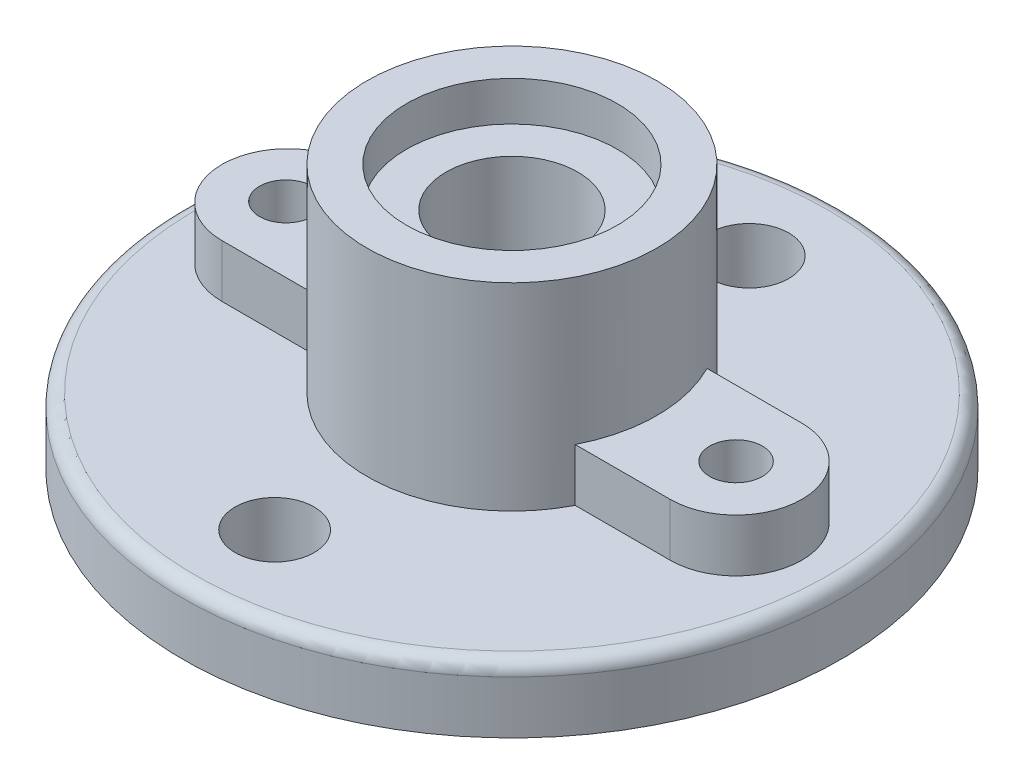
ISO-10303-21;
HEADER;
FILE_DESCRIPTION(('STEP AP214'),'2;1');
FILE_NAME('part.step','',(''),(''),'','','');
FILE_SCHEMA(('AUTOMOTIVE_DESIGN { 1 0 10303 214 1 1 1 1 }'));
ENDSEC;
DATA;
#1=APPLICATION_CONTEXT('core data for automotive mechanical design processes');
#2=APPLICATION_PROTOCOL_DEFINITION('international standard','automotive_design',2000,#1);
#3=PRODUCT_CONTEXT('',#1,'mechanical');
#4=PRODUCT('Part','Part','',(#3));
#5=PRODUCT_RELATED_PRODUCT_CATEGORY('part','',(#4));
#6=PRODUCT_DEFINITION_FORMATION('','',#4);
#7=PRODUCT_DEFINITION_CONTEXT('part definition',#1,'design');
#8=PRODUCT_DEFINITION('design','',#6,#7);
#9=PRODUCT_DEFINITION_SHAPE('','',#8);
#10=(LENGTH_UNIT() NAMED_UNIT(*) SI_UNIT(.MILLI.,.METRE.));
#11=(NAMED_UNIT(*) PLANE_ANGLE_UNIT() SI_UNIT($,.RADIAN.));
#12=(NAMED_UNIT(*) SI_UNIT($,.STERADIAN.) SOLID_ANGLE_UNIT());
#13=UNCERTAINTY_MEASURE_WITH_UNIT(LENGTH_MEASURE(1.E-05),#10,'distance_accuracy_value','');
#14=(GEOMETRIC_REPRESENTATION_CONTEXT(3) GLOBAL_UNCERTAINTY_ASSIGNED_CONTEXT((#13)) GLOBAL_UNIT_ASSIGNED_CONTEXT((#10,
#11,#12)) REPRESENTATION_CONTEXT('',''));
#15=CARTESIAN_POINT('',(0.,0.,0.));
#16=DIRECTION('',(0.,0.,1.));
#17=DIRECTION('',(1.,0.,0.));
#18=AXIS2_PLACEMENT_3D('',#15,#16,#17);
#19=CARTESIAN_POINT('',(0.,5.,0.));
#20=DIRECTION('',(0.,-1.,0.));
#21=DIRECTION('',(0.,0.,-1.));
#22=AXIS2_PLACEMENT_3D('',#19,#20,#21);
#23=PLANE('',#22);
#24=CARTESIAN_POINT('',(0.,5.,0.));
#25=DIRECTION('',(0.,-1.,0.));
#26=DIRECTION('',(0.,0.,-1.));
#27=AXIS2_PLACEMENT_3D('',#24,#25,#26);
#28=CIRCLE('',#27,24.);
#29=CARTESIAN_POINT('',(0.,5.,-24.));
#30=VERTEX_POINT('',#29);
#31=EDGE_CURVE('E11',#30,#30,#28,.F.);
#32=ORIENTED_EDGE('',*,*,#31,.T.);
#33=EDGE_LOOP('',(#32));
#34=FACE_BOUND('',#33,.T.);
#35=CARTESIAN_POINT('',(0.,5.,-18.));
#36=DIRECTION('',(0.,-1.,0.));
#37=DIRECTION('',(0.,0.,-1.));
#38=AXIS2_PLACEMENT_3D('',#35,#36,#37);
#39=CIRCLE('',#38,3.);
#40=CARTESIAN_POINT('',(0.,5.,-21.));
#41=VERTEX_POINT('',#40);
#42=EDGE_CURVE('E455',#41,#41,#39,.F.);
#43=ORIENTED_EDGE('',*,*,#42,.F.);
#44=EDGE_LOOP('',(#43));
#45=FACE_BOUND('',#44,.T.);
#46=CARTESIAN_POINT('',(0.,5.,18.));
#47=DIRECTION('',(0.,-1.,0.));
#48=DIRECTION('',(0.,0.,-1.));
#49=AXIS2_PLACEMENT_3D('',#46,#47,#48);
#50=CIRCLE('',#49,3.);
#51=CARTESIAN_POINT('',(0.,5.,15.));
#52=VERTEX_POINT('',#51);
#53=EDGE_CURVE('E452',#52,#52,#50,.F.);
#54=ORIENTED_EDGE('',*,*,#53,.F.);
#55=EDGE_LOOP('',(#54));
#56=FACE_BOUND('',#55,.T.);
#57=DIRECTION('',(1.,0.,0.));
#58=VECTOR('',#57,1.);
#59=CARTESIAN_POINT('',(0.,5.,5.));
#60=LINE('',#59,#58);
#61=CARTESIAN_POINT('',(9.79795897113272,5.,5.));
#62=VERTEX_POINT('',#61);
#63=CARTESIAN_POINT('',(17.,5.,5.));
#64=VERTEX_POINT('',#63);
#65=EDGE_CURVE('E144',#62,#64,#60,.T.);
#66=ORIENTED_EDGE('',*,*,#65,.F.);
#67=CARTESIAN_POINT('',(0.,5.,0.));
#68=DIRECTION('',(0.,-1.,0.));
#69=DIRECTION('',(0.,0.,-1.));
#70=AXIS2_PLACEMENT_3D('',#67,#68,#69);
#71=CIRCLE('',#70,11.);
#72=CARTESIAN_POINT('',(-9.79795897113271,5.,5.));
#73=VERTEX_POINT('',#72);
#74=EDGE_CURVE('E128',#62,#73,#71,.T.);
#75=ORIENTED_EDGE('',*,*,#74,.T.);
#76=DIRECTION('',(1.,0.,0.));
#77=VECTOR('',#76,1.);
#78=CARTESIAN_POINT('',(0.,5.,5.));
#79=LINE('',#78,#77);
#80=CARTESIAN_POINT('',(-17.,5.,5.));
#81=VERTEX_POINT('',#80);
#82=EDGE_CURVE('E178',#81,#73,#79,.T.);
#83=ORIENTED_EDGE('',*,*,#82,.F.);
#84=CARTESIAN_POINT('',(-17.,5.,0.));
#85=DIRECTION('',(0.,-1.,0.));
#86=DIRECTION('',(0.,0.,-1.));
#87=AXIS2_PLACEMENT_3D('',#84,#85,#86);
#88=CIRCLE('',#87,5.);
#89=CARTESIAN_POINT('',(-17.,5.,-5.));
#90=VERTEX_POINT('',#89);
#91=EDGE_CURVE('E114',#90,#81,#88,.F.);
#92=ORIENTED_EDGE('',*,*,#91,.F.);
#93=DIRECTION('',(1.,0.,0.));
#94=VECTOR('',#93,1.);
#95=CARTESIAN_POINT('',(0.,5.,-5.));
#96=LINE('',#95,#94);
#97=CARTESIAN_POINT('',(-9.79795897113272,5.,-5.));
#98=VERTEX_POINT('',#97);
#99=EDGE_CURVE('E174',#90,#98,#96,.T.);
#100=ORIENTED_EDGE('',*,*,#99,.T.);
#101=CARTESIAN_POINT('',(9.79795897113271,5.,-5.));
#102=VERTEX_POINT('',#101);
#103=EDGE_CURVE('E201',#98,#102,#71,.T.);
#104=ORIENTED_EDGE('',*,*,#103,.T.);
#105=DIRECTION('',(1.,0.,0.));
#106=VECTOR('',#105,1.);
#107=CARTESIAN_POINT('',(0.,5.,-5.));
#108=LINE('',#107,#106);
#109=CARTESIAN_POINT('',(17.,5.,-5.));
#110=VERTEX_POINT('',#109);
#111=EDGE_CURVE('E123',#102,#110,#108,.T.);
#112=ORIENTED_EDGE('',*,*,#111,.T.);
#113=CARTESIAN_POINT('',(17.,5.,0.));
#114=DIRECTION('',(0.,-1.,0.));
#115=DIRECTION('',(0.,0.,-1.));
#116=AXIS2_PLACEMENT_3D('',#113,#114,#115);
#117=CIRCLE('',#116,5.);
#118=EDGE_CURVE('E147',#64,#110,#117,.F.);
#119=ORIENTED_EDGE('',*,*,#118,.F.);
#120=EDGE_LOOP('',(#66,#75,#83,#92,#100,#104,#112,#119));
#121=FACE_BOUND('',#120,.T.);
#122=ADVANCED_FACE('F39',(#34,#45,#56,#121),#23,.F.);
#123=CARTESIAN_POINT('',(0.,0.,0.));
#124=DIRECTION('',(0.,-1.,0.));
#125=DIRECTION('',(0.,0.,-1.));
#126=AXIS2_PLACEMENT_3D('',#123,#124,#125);
#127=CYLINDRICAL_SURFACE('',#126,11.);
#128=CARTESIAN_POINT('',(0.,20.,0.));
#129=DIRECTION('',(0.,-1.,0.));
#130=DIRECTION('',(0.,0.,-1.));
#131=AXIS2_PLACEMENT_3D('',#128,#129,#130);
#132=CIRCLE('',#131,11.);
#133=CARTESIAN_POINT('',(0.,20.,-11.));
#134=VERTEX_POINT('',#133);
#135=EDGE_CURVE('E197',#134,#134,#132,.T.);
#136=ORIENTED_EDGE('',*,*,#135,.T.);
#137=EDGE_LOOP('',(#136));
#138=FACE_BOUND('',#137,.T.);
#139=DIRECTION('',(0.,-1.,0.));
#140=VECTOR('',#139,1.);
#141=CARTESIAN_POINT('',(9.79795897113272,9.,5.));
#142=LINE('',#141,#140);
#143=CARTESIAN_POINT('',(9.79795897113272,9.,5.));
#144=VERTEX_POINT('',#143);
#145=EDGE_CURVE('E118',#144,#62,#142,.T.);
#146=ORIENTED_EDGE('',*,*,#145,.F.);
#147=CARTESIAN_POINT('',(0.,9.,0.));
#148=DIRECTION('',(0.,1.,0.));
#149=DIRECTION('',(0.,0.,1.));
#150=AXIS2_PLACEMENT_3D('',#147,#148,#149);
#151=CIRCLE('',#150,11.);
#152=CARTESIAN_POINT('',(9.79795897113271,9.,-5.00000000000001));
#153=VERTEX_POINT('',#152);
#154=EDGE_CURVE('E105',#144,#153,#151,.T.);
#155=ORIENTED_EDGE('',*,*,#154,.T.);
#156=DIRECTION('',(0.,-1.,0.));
#157=VECTOR('',#156,1.);
#158=CARTESIAN_POINT('',(9.79795897113271,9.,-5.));
#159=LINE('',#158,#157);
#160=EDGE_CURVE('E130',#153,#102,#159,.T.);
#161=ORIENTED_EDGE('',*,*,#160,.T.);
#162=ORIENTED_EDGE('',*,*,#103,.F.);
#163=DIRECTION('',(0.,-1.,0.));
#164=VECTOR('',#163,1.);
#165=CARTESIAN_POINT('',(-9.79795897113272,9.,-5.));
#166=LINE('',#165,#164);
#167=CARTESIAN_POINT('',(-9.79795897113272,9.,-5.));
#168=VERTEX_POINT('',#167);
#169=EDGE_CURVE('E165',#168,#98,#166,.T.);
#170=ORIENTED_EDGE('',*,*,#169,.F.);
#171=CARTESIAN_POINT('',(0.,9.,0.));
#172=DIRECTION('',(0.,1.,0.));
#173=DIRECTION('',(0.,0.,1.));
#174=AXIS2_PLACEMENT_3D('',#171,#172,#173);
#175=CIRCLE('',#174,11.);
#176=CARTESIAN_POINT('',(-9.79795897113271,9.,5.00000000000001));
#177=VERTEX_POINT('',#176);
#178=EDGE_CURVE('E209',#168,#177,#175,.T.);
#179=ORIENTED_EDGE('',*,*,#178,.T.);
#180=DIRECTION('',(0.,-1.,0.));
#181=VECTOR('',#180,1.);
#182=CARTESIAN_POINT('',(-9.79795897113271,9.,5.));
#183=LINE('',#182,#181);
#184=EDGE_CURVE('E63',#177,#73,#183,.T.);
#185=ORIENTED_EDGE('',*,*,#184,.T.);
#186=ORIENTED_EDGE('',*,*,#74,.F.);
#187=EDGE_LOOP('',(#146,#155,#161,#162,#170,#179,#185,#186));
#188=FACE_BOUND('',#187,.T.);
#189=ADVANCED_FACE('F127',(#138,#188),#127,.T.);
#190=CARTESIAN_POINT('',(0.,0.,0.));
#191=DIRECTION('',(0.,1.,0.));
#192=DIRECTION('',(0.,0.,1.));
#193=AXIS2_PLACEMENT_3D('',#190,#191,#192);
#194=PLANE('',#193);
#195=CARTESIAN_POINT('',(-17.1423749287793,0.,0.));
#196=DIRECTION('',(0.,1.,0.));
#197=DIRECTION('',(0.,0.,1.));
#198=AXIS2_PLACEMENT_3D('',#195,#196,#197);
#199=CIRCLE('',#198,2.);
#200=CARTESIAN_POINT('',(-17.1423749287793,0.,2.));
#201=VERTEX_POINT('',#200);
#202=EDGE_CURVE('E252',#201,#201,#199,.T.);
#203=ORIENTED_EDGE('',*,*,#202,.T.);
#204=EDGE_LOOP('',(#203));
#205=FACE_BOUND('',#204,.T.);
#206=CARTESIAN_POINT('',(17.,0.,0.));
#207=DIRECTION('',(0.,1.,0.));
#208=DIRECTION('',(0.,0.,1.));
#209=AXIS2_PLACEMENT_3D('',#206,#207,#208);
#210=CIRCLE('',#209,2.);
#211=CARTESIAN_POINT('',(17.,0.,2.));
#212=VERTEX_POINT('',#211);
#213=EDGE_CURVE('E256',#212,#212,#210,.T.);
#214=ORIENTED_EDGE('',*,*,#213,.T.);
#215=EDGE_LOOP('',(#214));
#216=FACE_BOUND('',#215,.T.);
#217=CARTESIAN_POINT('',(0.,0.,-18.));
#218=DIRECTION('',(0.,1.,0.));
#219=DIRECTION('',(0.,0.,1.));
#220=AXIS2_PLACEMENT_3D('',#217,#218,#219);
#221=CIRCLE('',#220,3.);
#222=CARTESIAN_POINT('',(0.,0.,-15.));
#223=VERTEX_POINT('',#222);
#224=EDGE_CURVE('E260',#223,#223,#221,.T.);
#225=ORIENTED_EDGE('',*,*,#224,.T.);
#226=EDGE_LOOP('',(#225));
#227=FACE_BOUND('',#226,.T.);
#228=CARTESIAN_POINT('',(0.,0.,18.));
#229=DIRECTION('',(0.,1.,0.));
#230=DIRECTION('',(0.,0.,1.));
#231=AXIS2_PLACEMENT_3D('',#228,#229,#230);
#232=CIRCLE('',#231,3.);
#233=CARTESIAN_POINT('',(0.,0.,21.));
#234=VERTEX_POINT('',#233);
#235=EDGE_CURVE('E264',#234,#234,#232,.T.);
#236=ORIENTED_EDGE('',*,*,#235,.T.);
#237=EDGE_LOOP('',(#236));
#238=FACE_BOUND('',#237,.T.);
#239=CARTESIAN_POINT('',(0.,0.,0.));
#240=DIRECTION('',(0.,1.,0.));
#241=DIRECTION('',(0.,0.,1.));
#242=AXIS2_PLACEMENT_3D('',#239,#240,#241);
#243=CIRCLE('',#242,5.);
#244=CARTESIAN_POINT('',(0.,0.,5.));
#245=VERTEX_POINT('',#244);
#246=EDGE_CURVE('E189',#245,#245,#243,.T.);
#247=ORIENTED_EDGE('',*,*,#246,.T.);
#248=EDGE_LOOP('',(#247));
#249=FACE_BOUND('',#248,.T.);
#250=CARTESIAN_POINT('',(0.,0.,0.));
#251=DIRECTION('',(0.,-1.,0.));
#252=DIRECTION('',(0.,0.,-1.));
#253=AXIS2_PLACEMENT_3D('',#250,#251,#252);
#254=CIRCLE('',#253,25.);
#255=CARTESIAN_POINT('',(0.,0.,-25.));
#256=VERTEX_POINT('',#255);
#257=EDGE_CURVE('E205',#256,#256,#254,.T.);
#258=ORIENTED_EDGE('',*,*,#257,.T.);
#259=EDGE_LOOP('',(#258));
#260=FACE_BOUND('',#259,.T.);
#261=ADVANCED_FACE('F237',(#205,#216,#227,#238,#249,#260),#194,.F.);
#262=CARTESIAN_POINT('',(0.,0.,0.));
#263=DIRECTION('',(0.,-1.,0.));
#264=DIRECTION('',(0.,0.,-1.));
#265=AXIS2_PLACEMENT_3D('',#262,#263,#264);
#266=CYLINDRICAL_SURFACE('',#265,25.);
#267=CARTESIAN_POINT('',(0.,4.,0.));
#268=DIRECTION('',(0.,-1.,0.));
#269=DIRECTION('',(0.,0.,-1.));
#270=AXIS2_PLACEMENT_3D('',#267,#268,#269);
#271=CIRCLE('',#270,25.);
#272=CARTESIAN_POINT('',(0.,4.,-25.));
#273=VERTEX_POINT('',#272);
#274=EDGE_CURVE('E48',#273,#273,#271,.T.);
#275=ORIENTED_EDGE('',*,*,#274,.T.);
#276=EDGE_LOOP('',(#275));
#277=FACE_BOUND('',#276,.T.);
#278=ORIENTED_EDGE('',*,*,#257,.F.);
#279=EDGE_LOOP('',(#278));
#280=FACE_BOUND('',#279,.T.);
#281=ADVANCED_FACE('F218',(#277,#280),#266,.T.);
#282=CARTESIAN_POINT('',(0.,20.,0.));
#283=DIRECTION('',(0.,-1.,0.));
#284=DIRECTION('',(0.,0.,-1.));
#285=AXIS2_PLACEMENT_3D('',#282,#283,#284);
#286=PLANE('',#285);
#287=CARTESIAN_POINT('',(0.,20.,0.));
#288=DIRECTION('',(0.,1.,0.));
#289=DIRECTION('',(0.,0.,1.));
#290=AXIS2_PLACEMENT_3D('',#287,#288,#289);
#291=CIRCLE('',#290,8.);
#292=CARTESIAN_POINT('',(0.,20.,8.));
#293=VERTEX_POINT('',#292);
#294=EDGE_CURVE('E193',#293,#293,#291,.T.);
#295=ORIENTED_EDGE('',*,*,#294,.F.);
#296=EDGE_LOOP('',(#295));
#297=FACE_BOUND('',#296,.T.);
#298=ORIENTED_EDGE('',*,*,#135,.F.);
#299=EDGE_LOOP('',(#298));
#300=FACE_BOUND('',#299,.T.);
#301=ADVANCED_FACE('F244',(#297,#300),#286,.F.);
#302=CARTESIAN_POINT('',(0.,20.,0.));
#303=DIRECTION('',(0.,1.,0.));
#304=DIRECTION('',(0.,0.,1.));
#305=AXIS2_PLACEMENT_3D('',#302,#303,#304);
#306=CYLINDRICAL_SURFACE('',#305,8.);
#307=ORIENTED_EDGE('',*,*,#294,.T.);
#308=EDGE_LOOP('',(#307));
#309=FACE_BOUND('',#308,.T.);
#310=CARTESIAN_POINT('',(0.,17.,0.));
#311=DIRECTION('',(0.,1.,0.));
#312=DIRECTION('',(0.,0.,1.));
#313=AXIS2_PLACEMENT_3D('',#310,#311,#312);
#314=CIRCLE('',#313,8.);
#315=CARTESIAN_POINT('',(0.,17.,8.));
#316=VERTEX_POINT('',#315);
#317=EDGE_CURVE('E181',#316,#316,#314,.T.);
#318=ORIENTED_EDGE('',*,*,#317,.F.);
#319=EDGE_LOOP('',(#318));
#320=FACE_BOUND('',#319,.T.);
#321=ADVANCED_FACE('F272',(#309,#320),#306,.F.);
#322=CARTESIAN_POINT('',(0.,20.,0.));
#323=DIRECTION('',(0.,1.,0.));
#324=DIRECTION('',(0.,0.,1.));
#325=AXIS2_PLACEMENT_3D('',#322,#323,#324);
#326=CYLINDRICAL_SURFACE('',#325,5.);
#327=CARTESIAN_POINT('',(0.,17.,0.));
#328=DIRECTION('',(0.,1.,0.));
#329=DIRECTION('',(0.,0.,1.));
#330=AXIS2_PLACEMENT_3D('',#327,#328,#329);
#331=CIRCLE('',#330,5.);
#332=CARTESIAN_POINT('',(0.,17.,5.));
#333=VERTEX_POINT('',#332);
#334=EDGE_CURVE('E185',#333,#333,#331,.T.);
#335=ORIENTED_EDGE('',*,*,#334,.T.);
#336=EDGE_LOOP('',(#335));
#337=FACE_BOUND('',#336,.T.);
#338=ORIENTED_EDGE('',*,*,#246,.F.);
#339=EDGE_LOOP('',(#338));
#340=FACE_BOUND('',#339,.T.);
#341=ADVANCED_FACE('F269',(#337,#340),#326,.F.);
#342=CARTESIAN_POINT('',(5.,17.,0.));
#343=DIRECTION('',(0.,1.,0.));
#344=DIRECTION('',(0.,0.,1.));
#345=AXIS2_PLACEMENT_3D('',#342,#343,#344);
#346=PLANE('',#345);
#347=ORIENTED_EDGE('',*,*,#317,.T.);
#348=EDGE_LOOP('',(#347));
#349=FACE_BOUND('',#348,.T.);
#350=ORIENTED_EDGE('',*,*,#334,.F.);
#351=EDGE_LOOP('',(#350));
#352=FACE_BOUND('',#351,.T.);
#353=ADVANCED_FACE('F271',(#349,#352),#346,.T.);
#354=CARTESIAN_POINT('',(-17.,9.,0.));
#355=DIRECTION('',(0.,-1.,0.));
#356=DIRECTION('',(0.,0.,-1.));
#357=AXIS2_PLACEMENT_3D('',#354,#355,#356);
#358=CYLINDRICAL_SURFACE('',#357,5.);
#359=DIRECTION('',(0.,-1.,0.));
#360=VECTOR('',#359,1.);
#361=CARTESIAN_POINT('',(-17.,9.,-5.));
#362=LINE('',#361,#360);
#363=CARTESIAN_POINT('',(-17.,9.,-5.));
#364=VERTEX_POINT('',#363);
#365=EDGE_CURVE('E161',#364,#90,#362,.T.);
#366=ORIENTED_EDGE('',*,*,#365,.T.);
#367=ORIENTED_EDGE('',*,*,#91,.T.);
#368=DIRECTION('',(0.,-1.,0.));
#369=VECTOR('',#368,1.);
#370=CARTESIAN_POINT('',(-17.,9.,5.));
#371=LINE('',#370,#369);
#372=CARTESIAN_POINT('',(-17.,9.,5.));
#373=VERTEX_POINT('',#372);
#374=EDGE_CURVE('E170',#373,#81,#371,.T.);
#375=ORIENTED_EDGE('',*,*,#374,.F.);
#376=CARTESIAN_POINT('',(-17.,9.,0.));
#377=DIRECTION('',(0.,1.,0.));
#378=DIRECTION('',(0.,0.,1.));
#379=AXIS2_PLACEMENT_3D('',#376,#377,#378);
#380=CIRCLE('',#379,5.);
#381=EDGE_CURVE('E150',#364,#373,#380,.T.);
#382=ORIENTED_EDGE('',*,*,#381,.F.);
#383=EDGE_LOOP('',(#366,#367,#375,#382));
#384=FACE_BOUND('',#383,.T.);
#385=ADVANCED_FACE('F279',(#384),#358,.T.);
#386=CARTESIAN_POINT('',(-17.,9.,5.));
#387=DIRECTION('',(0.,0.,-1.));
#388=DIRECTION('',(-1.,0.,0.));
#389=AXIS2_PLACEMENT_3D('',#386,#387,#388);
#390=PLANE('',#389);
#391=ORIENTED_EDGE('',*,*,#374,.T.);
#392=ORIENTED_EDGE('',*,*,#82,.T.);
#393=ORIENTED_EDGE('',*,*,#184,.F.);
#394=DIRECTION('',(1.,0.,0.));
#395=VECTOR('',#394,1.);
#396=CARTESIAN_POINT('',(-17.,9.,5.));
#397=LINE('',#396,#395);
#398=EDGE_CURVE('E154',#373,#177,#397,.T.);
#399=ORIENTED_EDGE('',*,*,#398,.F.);
#400=EDGE_LOOP('',(#391,#392,#393,#399));
#401=FACE_BOUND('',#400,.T.);
#402=ADVANCED_FACE('F328',(#401),#390,.F.);
#403=CARTESIAN_POINT('',(-17.,9.,-5.));
#404=DIRECTION('',(0.,0.,-1.));
#405=DIRECTION('',(-1.,0.,0.));
#406=AXIS2_PLACEMENT_3D('',#403,#404,#405);
#407=PLANE('',#406);
#408=ORIENTED_EDGE('',*,*,#99,.F.);
#409=ORIENTED_EDGE('',*,*,#365,.F.);
#410=DIRECTION('',(1.,0.,0.));
#411=VECTOR('',#410,1.);
#412=CARTESIAN_POINT('',(-17.,9.,-5.));
#413=LINE('',#412,#411);
#414=EDGE_CURVE('E157',#364,#168,#413,.T.);
#415=ORIENTED_EDGE('',*,*,#414,.T.);
#416=ORIENTED_EDGE('',*,*,#169,.T.);
#417=EDGE_LOOP('',(#408,#409,#415,#416));
#418=FACE_BOUND('',#417,.T.);
#419=ADVANCED_FACE('F337',(#418),#407,.T.);
#420=CARTESIAN_POINT('',(-17.,9.,0.));
#421=DIRECTION('',(0.,1.,0.));
#422=DIRECTION('',(0.,0.,1.));
#423=AXIS2_PLACEMENT_3D('',#420,#421,#422);
#424=PLANE('',#423);
#425=CARTESIAN_POINT('',(-17.1423749287793,9.,0.));
#426=DIRECTION('',(0.,1.,0.));
#427=DIRECTION('',(0.,0.,1.));
#428=AXIS2_PLACEMENT_3D('',#425,#426,#427);
#429=CIRCLE('',#428,2.);
#430=CARTESIAN_POINT('',(-17.1423749287793,9.,2.));
#431=VERTEX_POINT('',#430);
#432=EDGE_CURVE('E456',#431,#431,#429,.T.);
#433=ORIENTED_EDGE('',*,*,#432,.F.);
#434=EDGE_LOOP('',(#433));
#435=FACE_BOUND('',#434,.T.);
#436=ORIENTED_EDGE('',*,*,#178,.F.);
#437=ORIENTED_EDGE('',*,*,#414,.F.);
#438=ORIENTED_EDGE('',*,*,#381,.T.);
#439=ORIENTED_EDGE('',*,*,#398,.T.);
#440=EDGE_LOOP('',(#436,#437,#438,#439));
#441=FACE_BOUND('',#440,.T.);
#442=ADVANCED_FACE('F346',(#435,#441),#424,.T.);
#443=CARTESIAN_POINT('',(17.,9.,0.));
#444=DIRECTION('',(0.,-1.,0.));
#445=DIRECTION('',(0.,0.,-1.));
#446=AXIS2_PLACEMENT_3D('',#443,#444,#445);
#447=CYLINDRICAL_SURFACE('',#446,5.);
#448=DIRECTION('',(0.,-1.,0.));
#449=VECTOR('',#448,1.);
#450=CARTESIAN_POINT('',(17.,9.,5.));
#451=LINE('',#450,#449);
#452=CARTESIAN_POINT('',(17.,9.,5.));
#453=VERTEX_POINT('',#452);
#454=EDGE_CURVE('E121',#453,#64,#451,.T.);
#455=ORIENTED_EDGE('',*,*,#454,.T.);
#456=ORIENTED_EDGE('',*,*,#118,.T.);
#457=DIRECTION('',(0.,-1.,0.));
#458=VECTOR('',#457,1.);
#459=CARTESIAN_POINT('',(17.,9.,-5.));
#460=LINE('',#459,#458);
#461=CARTESIAN_POINT('',(17.,9.,-5.));
#462=VERTEX_POINT('',#461);
#463=EDGE_CURVE('E135',#462,#110,#460,.T.);
#464=ORIENTED_EDGE('',*,*,#463,.F.);
#465=CARTESIAN_POINT('',(17.,9.,0.));
#466=DIRECTION('',(0.,1.,0.));
#467=DIRECTION('',(0.,0.,1.));
#468=AXIS2_PLACEMENT_3D('',#465,#466,#467);
#469=CIRCLE('',#468,5.);
#470=EDGE_CURVE('E124',#453,#462,#469,.T.);
#471=ORIENTED_EDGE('',*,*,#470,.F.);
#472=EDGE_LOOP('',(#455,#456,#464,#471));
#473=FACE_BOUND('',#472,.T.);
#474=ADVANCED_FACE('F354',(#473),#447,.T.);
#475=CARTESIAN_POINT('',(9.79795897113272,9.,5.));
#476=DIRECTION('',(0.,0.,-1.));
#477=DIRECTION('',(-1.,0.,0.));
#478=AXIS2_PLACEMENT_3D('',#475,#476,#477);
#479=PLANE('',#478);
#480=ORIENTED_EDGE('',*,*,#145,.T.);
#481=ORIENTED_EDGE('',*,*,#65,.T.);
#482=ORIENTED_EDGE('',*,*,#454,.F.);
#483=DIRECTION('',(1.,0.,0.));
#484=VECTOR('',#483,1.);
#485=CARTESIAN_POINT('',(9.79795897113272,9.,5.));
#486=LINE('',#485,#484);
#487=EDGE_CURVE('E108',#144,#453,#486,.T.);
#488=ORIENTED_EDGE('',*,*,#487,.F.);
#489=EDGE_LOOP('',(#480,#481,#482,#488));
#490=FACE_BOUND('',#489,.T.);
#491=ADVANCED_FACE('F117',(#490),#479,.F.);
#492=CARTESIAN_POINT('',(9.79795897113271,9.,-5.));
#493=DIRECTION('',(0.,0.,-1.));
#494=DIRECTION('',(-1.,0.,0.));
#495=AXIS2_PLACEMENT_3D('',#492,#493,#494);
#496=PLANE('',#495);
#497=ORIENTED_EDGE('',*,*,#111,.F.);
#498=ORIENTED_EDGE('',*,*,#160,.F.);
#499=DIRECTION('',(1.,0.,0.));
#500=VECTOR('',#499,1.);
#501=CARTESIAN_POINT('',(9.79795897113271,9.,-5.));
#502=LINE('',#501,#500);
#503=EDGE_CURVE('E55',#153,#462,#502,.T.);
#504=ORIENTED_EDGE('',*,*,#503,.T.);
#505=ORIENTED_EDGE('',*,*,#463,.T.);
#506=EDGE_LOOP('',(#497,#498,#504,#505));
#507=FACE_BOUND('',#506,.T.);
#508=ADVANCED_FACE('F368',(#507),#496,.T.);
#509=CARTESIAN_POINT('',(17.,9.,0.));
#510=DIRECTION('',(0.,1.,0.));
#511=DIRECTION('',(0.,0.,1.));
#512=AXIS2_PLACEMENT_3D('',#509,#510,#511);
#513=PLANE('',#512);
#514=CARTESIAN_POINT('',(17.,9.,0.));
#515=DIRECTION('',(0.,1.,0.));
#516=DIRECTION('',(0.,0.,1.));
#517=AXIS2_PLACEMENT_3D('',#514,#515,#516);
#518=CIRCLE('',#517,2.);
#519=CARTESIAN_POINT('',(17.,9.,2.));
#520=VERTEX_POINT('',#519);
#521=EDGE_CURVE('E487',#520,#520,#518,.T.);
#522=ORIENTED_EDGE('',*,*,#521,.F.);
#523=EDGE_LOOP('',(#522));
#524=FACE_BOUND('',#523,.T.);
#525=ORIENTED_EDGE('',*,*,#154,.F.);
#526=ORIENTED_EDGE('',*,*,#487,.T.);
#527=ORIENTED_EDGE('',*,*,#470,.T.);
#528=ORIENTED_EDGE('',*,*,#503,.F.);
#529=EDGE_LOOP('',(#525,#526,#527,#528));
#530=FACE_BOUND('',#529,.T.);
#531=ADVANCED_FACE('F107',(#524,#530),#513,.T.);
#532=CARTESIAN_POINT('',(17.,9.,0.));
#533=DIRECTION('',(0.,-1.,0.));
#534=DIRECTION('',(0.,0.,-1.));
#535=AXIS2_PLACEMENT_3D('',#532,#533,#534);
#536=CYLINDRICAL_SURFACE('',#535,2.);
#537=ORIENTED_EDGE('',*,*,#521,.T.);
#538=EDGE_LOOP('',(#537));
#539=FACE_BOUND('',#538,.T.);
#540=ORIENTED_EDGE('',*,*,#213,.F.);
#541=EDGE_LOOP('',(#540));
#542=FACE_BOUND('',#541,.T.);
#543=ADVANCED_FACE('F398',(#539,#542),#536,.F.);
#544=CARTESIAN_POINT('',(-17.1423749287793,9.,0.));
#545=DIRECTION('',(0.,-1.,0.));
#546=DIRECTION('',(0.,0.,-1.));
#547=AXIS2_PLACEMENT_3D('',#544,#545,#546);
#548=CYLINDRICAL_SURFACE('',#547,2.);
#549=ORIENTED_EDGE('',*,*,#432,.T.);
#550=EDGE_LOOP('',(#549));
#551=FACE_BOUND('',#550,.T.);
#552=ORIENTED_EDGE('',*,*,#202,.F.);
#553=EDGE_LOOP('',(#552));
#554=FACE_BOUND('',#553,.T.);
#555=ADVANCED_FACE('F408',(#551,#554),#548,.F.);
#556=CARTESIAN_POINT('',(0.,9.,18.));
#557=DIRECTION('',(0.,-1.,0.));
#558=DIRECTION('',(0.,0.,-1.));
#559=AXIS2_PLACEMENT_3D('',#556,#557,#558);
#560=CYLINDRICAL_SURFACE('',#559,3.);
#561=ORIENTED_EDGE('',*,*,#235,.F.);
#562=EDGE_LOOP('',(#561));
#563=FACE_BOUND('',#562,.T.);
#564=ORIENTED_EDGE('',*,*,#53,.T.);
#565=EDGE_LOOP('',(#564));
#566=FACE_BOUND('',#565,.T.);
#567=ADVANCED_FACE('F227',(#563,#566),#560,.F.);
#568=CARTESIAN_POINT('',(0.,9.,-18.));
#569=DIRECTION('',(0.,-1.,0.));
#570=DIRECTION('',(0.,0.,-1.));
#571=AXIS2_PLACEMENT_3D('',#568,#569,#570);
#572=CYLINDRICAL_SURFACE('',#571,3.);
#573=ORIENTED_EDGE('',*,*,#224,.F.);
#574=EDGE_LOOP('',(#573));
#575=FACE_BOUND('',#574,.T.);
#576=ORIENTED_EDGE('',*,*,#42,.T.);
#577=EDGE_LOOP('',(#576));
#578=FACE_BOUND('',#577,.T.);
#579=ADVANCED_FACE('F222',(#575,#578),#572,.F.);
#580=CARTESIAN_POINT('',(0.,4.,0.));
#581=DIRECTION('',(0.,-1.,0.));
#582=DIRECTION('',(0.,0.,-1.));
#583=AXIS2_PLACEMENT_3D('',#580,#581,#582);
#584=TOROIDAL_SURFACE('',#583,24.,1.);
#585=ORIENTED_EDGE('',*,*,#31,.F.);
#586=EDGE_LOOP('',(#585));
#587=FACE_BOUND('',#586,.T.);
#588=ORIENTED_EDGE('',*,*,#274,.F.);
#589=EDGE_LOOP('',(#588));
#590=FACE_BOUND('',#589,.T.);
#591=ADVANCED_FACE('F41',(#587,#590),#584,.T.);
#592=CLOSED_SHELL('',(#122,#189,#261,#281,#301,#321,#341,#353,#385,#402,#419,#442,#474,#491,
#508,#531,#543,#555,#567,#579,#591));
#593=MANIFOLD_SOLID_BREP('B2',#592);
#594=ADVANCED_BREP_SHAPE_REPRESENTATION('',(#18,#593),#14);
#595=SHAPE_DEFINITION_REPRESENTATION(#9,#594);
ENDSEC;
END-ISO-10303-21;
